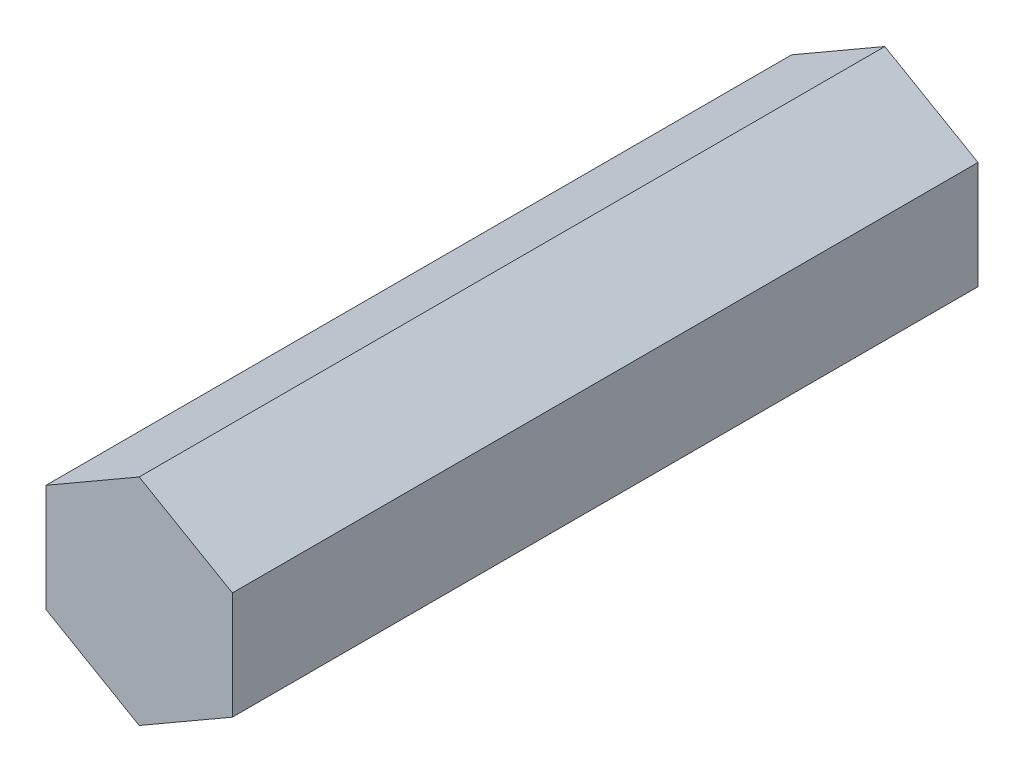
ISO-10303-21;
HEADER;
FILE_DESCRIPTION(('STEP AP214'),'2;1');
FILE_NAME('part.step','',(''),(''),'','','');
FILE_SCHEMA(('AUTOMOTIVE_DESIGN { 1 0 10303 214 1 1 1 1 }'));
ENDSEC;
DATA;
#1=APPLICATION_CONTEXT('core data for automotive mechanical design processes');
#2=APPLICATION_PROTOCOL_DEFINITION('international standard','automotive_design',2000,#1);
#3=PRODUCT_CONTEXT('',#1,'mechanical');
#4=PRODUCT('Part','Part','',(#3));
#5=PRODUCT_RELATED_PRODUCT_CATEGORY('part','',(#4));
#6=PRODUCT_DEFINITION_FORMATION('','',#4);
#7=PRODUCT_DEFINITION_CONTEXT('part definition',#1,'design');
#8=PRODUCT_DEFINITION('design','',#6,#7);
#9=PRODUCT_DEFINITION_SHAPE('','',#8);
#10=(LENGTH_UNIT() NAMED_UNIT(*) SI_UNIT(.MILLI.,.METRE.));
#11=(NAMED_UNIT(*) PLANE_ANGLE_UNIT() SI_UNIT($,.RADIAN.));
#12=(NAMED_UNIT(*) SI_UNIT($,.STERADIAN.) SOLID_ANGLE_UNIT());
#13=UNCERTAINTY_MEASURE_WITH_UNIT(LENGTH_MEASURE(1.E-05),#10,'distance_accuracy_value','');
#14=(GEOMETRIC_REPRESENTATION_CONTEXT(3) GLOBAL_UNCERTAINTY_ASSIGNED_CONTEXT((#13)) GLOBAL_UNIT_ASSIGNED_CONTEXT((#10,
#11,#12)) REPRESENTATION_CONTEXT('',''));
#15=CARTESIAN_POINT('',(0.,0.,0.));
#16=DIRECTION('',(0.,0.,1.));
#17=DIRECTION('',(1.,0.,0.));
#18=AXIS2_PLACEMENT_3D('',#15,#16,#17);
#19=CARTESIAN_POINT('',(-6.35,3.66617420935413,50.8));
#20=DIRECTION('',(1.,0.,0.));
#21=DIRECTION('',(0.,1.,0.));
#22=AXIS2_PLACEMENT_3D('',#19,#20,#21);
#23=PLANE('',#22);
#24=DIRECTION('',(0.,-1.,0.));
#25=VECTOR('',#24,1.);
#26=CARTESIAN_POINT('',(-6.35,3.66617420935413,0.));
#27=LINE('',#26,#25);
#28=CARTESIAN_POINT('',(-6.35,3.66617420935413,0.));
#29=VERTEX_POINT('',#28);
#30=CARTESIAN_POINT('',(-6.35,-3.66617420935412,0.));
#31=VERTEX_POINT('',#30);
#32=EDGE_CURVE('E117',#29,#31,#27,.T.);
#33=ORIENTED_EDGE('',*,*,#32,.T.);
#34=DIRECTION('',(0.,0.,-1.));
#35=VECTOR('',#34,1.);
#36=CARTESIAN_POINT('',(-6.35,-3.66617420935412,50.8));
#37=LINE('',#36,#35);
#38=CARTESIAN_POINT('',(-6.35,-3.66617420935412,50.8));
#39=VERTEX_POINT('',#38);
#40=EDGE_CURVE('E11',#39,#31,#37,.T.);
#41=ORIENTED_EDGE('',*,*,#40,.F.);
#42=DIRECTION('',(0.,-1.,0.));
#43=VECTOR('',#42,1.);
#44=CARTESIAN_POINT('',(-6.35,3.66617420935413,50.8));
#45=LINE('',#44,#43);
#46=CARTESIAN_POINT('',(-6.35,3.66617420935413,50.8));
#47=VERTEX_POINT('',#46);
#48=EDGE_CURVE('E127',#47,#39,#45,.T.);
#49=ORIENTED_EDGE('',*,*,#48,.F.);
#50=DIRECTION('',(0.,0.,-1.));
#51=VECTOR('',#50,1.);
#52=CARTESIAN_POINT('',(-6.35,3.66617420935413,50.8));
#53=LINE('',#52,#51);
#54=EDGE_CURVE('E113',#47,#29,#53,.T.);
#55=ORIENTED_EDGE('',*,*,#54,.T.);
#56=EDGE_LOOP('',(#33,#41,#49,#55));
#57=FACE_BOUND('',#56,.T.);
#58=ADVANCED_FACE('F33',(#57),#23,.F.);
#59=CARTESIAN_POINT('',(-6.35,-3.66617420935412,50.8));
#60=DIRECTION('',(0.5,0.866025403784439,0.));
#61=DIRECTION('',(-0.866025403784439,0.5,0.));
#62=AXIS2_PLACEMENT_3D('',#59,#60,#61);
#63=PLANE('',#62);
#64=DIRECTION('',(0.866025403784438,-0.5,0.));
#65=VECTOR('',#64,1.);
#66=CARTESIAN_POINT('',(-6.35,-3.66617420935412,0.));
#67=LINE('',#66,#65);
#68=CARTESIAN_POINT('',(0.,-7.33234841870825,0.));
#69=VERTEX_POINT('',#68);
#70=EDGE_CURVE('E120',#31,#69,#67,.T.);
#71=ORIENTED_EDGE('',*,*,#70,.T.);
#72=DIRECTION('',(0.,0.,-1.));
#73=VECTOR('',#72,1.);
#74=CARTESIAN_POINT('',(0.,-7.33234841870825,50.8));
#75=LINE('',#74,#73);
#76=CARTESIAN_POINT('',(0.,-7.33234841870825,50.8));
#77=VERTEX_POINT('',#76);
#78=EDGE_CURVE('E41',#77,#69,#75,.T.);
#79=ORIENTED_EDGE('',*,*,#78,.F.);
#80=DIRECTION('',(0.866025403784438,-0.5,0.));
#81=VECTOR('',#80,1.);
#82=CARTESIAN_POINT('',(-6.35,-3.66617420935412,50.8));
#83=LINE('',#82,#81);
#84=EDGE_CURVE('E86',#39,#77,#83,.T.);
#85=ORIENTED_EDGE('',*,*,#84,.F.);
#86=ORIENTED_EDGE('',*,*,#40,.T.);
#87=EDGE_LOOP('',(#71,#79,#85,#86));
#88=FACE_BOUND('',#87,.T.);
#89=ADVANCED_FACE('F151',(#88),#63,.F.);
#90=CARTESIAN_POINT('',(0.,-7.33234841870825,50.8));
#91=DIRECTION('',(-0.5,0.866025403784439,0.));
#92=DIRECTION('',(-0.866025403784439,-0.5,0.));
#93=AXIS2_PLACEMENT_3D('',#90,#91,#92);
#94=PLANE('',#93);
#95=DIRECTION('',(0.866025403784439,0.5,0.));
#96=VECTOR('',#95,1.);
#97=CARTESIAN_POINT('',(0.,-7.33234841870825,0.));
#98=LINE('',#97,#96);
#99=CARTESIAN_POINT('',(6.35,-3.66617420935412,0.));
#100=VERTEX_POINT('',#99);
#101=EDGE_CURVE('E122',#69,#100,#98,.T.);
#102=ORIENTED_EDGE('',*,*,#101,.T.);
#103=DIRECTION('',(0.,0.,-1.));
#104=VECTOR('',#103,1.);
#105=CARTESIAN_POINT('',(6.35,-3.66617420935412,50.8));
#106=LINE('',#105,#104);
#107=CARTESIAN_POINT('',(6.35,-3.66617420935412,50.8));
#108=VERTEX_POINT('',#107);
#109=EDGE_CURVE('E108',#108,#100,#106,.T.);
#110=ORIENTED_EDGE('',*,*,#109,.F.);
#111=DIRECTION('',(0.866025403784439,0.5,0.));
#112=VECTOR('',#111,1.);
#113=CARTESIAN_POINT('',(0.,-7.33234841870825,50.8));
#114=LINE('',#113,#112);
#115=EDGE_CURVE('E99',#77,#108,#114,.T.);
#116=ORIENTED_EDGE('',*,*,#115,.F.);
#117=ORIENTED_EDGE('',*,*,#78,.T.);
#118=EDGE_LOOP('',(#102,#110,#116,#117));
#119=FACE_BOUND('',#118,.T.);
#120=ADVANCED_FACE('F133',(#119),#94,.F.);
#121=CARTESIAN_POINT('',(6.35,-3.66617420935412,50.8));
#122=DIRECTION('',(-1.,0.,0.));
#123=DIRECTION('',(0.,0.,1.));
#124=AXIS2_PLACEMENT_3D('',#121,#122,#123);
#125=PLANE('',#124);
#126=DIRECTION('',(0.,1.,0.));
#127=VECTOR('',#126,1.);
#128=CARTESIAN_POINT('',(6.35,-3.66617420935412,0.));
#129=LINE('',#128,#127);
#130=CARTESIAN_POINT('',(6.35,3.66617420935413,0.));
#131=VERTEX_POINT('',#130);
#132=EDGE_CURVE('E107',#100,#131,#129,.T.);
#133=ORIENTED_EDGE('',*,*,#132,.T.);
#134=DIRECTION('',(0.,0.,-1.));
#135=VECTOR('',#134,1.);
#136=CARTESIAN_POINT('',(6.35,3.66617420935413,50.8));
#137=LINE('',#136,#135);
#138=CARTESIAN_POINT('',(6.35,3.66617420935413,50.8));
#139=VERTEX_POINT('',#138);
#140=EDGE_CURVE('E104',#139,#131,#137,.T.);
#141=ORIENTED_EDGE('',*,*,#140,.F.);
#142=DIRECTION('',(0.,1.,0.));
#143=VECTOR('',#142,1.);
#144=CARTESIAN_POINT('',(6.35,-3.66617420935412,50.8));
#145=LINE('',#144,#143);
#146=EDGE_CURVE('E93',#108,#139,#145,.T.);
#147=ORIENTED_EDGE('',*,*,#146,.F.);
#148=ORIENTED_EDGE('',*,*,#109,.T.);
#149=EDGE_LOOP('',(#133,#141,#147,#148));
#150=FACE_BOUND('',#149,.T.);
#151=ADVANCED_FACE('F105',(#150),#125,.F.);
#152=CARTESIAN_POINT('',(6.35,3.66617420935413,50.8));
#153=DIRECTION('',(-0.5,-0.866025403784439,0.));
#154=DIRECTION('',(0.866025403784439,-0.5,0.));
#155=AXIS2_PLACEMENT_3D('',#152,#153,#154);
#156=PLANE('',#155);
#157=DIRECTION('',(-0.866025403784439,0.5,0.));
#158=VECTOR('',#157,1.);
#159=CARTESIAN_POINT('',(6.35,3.66617420935413,0.));
#160=LINE('',#159,#158);
#161=CARTESIAN_POINT('',(0.,7.33234841870825,0.));
#162=VERTEX_POINT('',#161);
#163=EDGE_CURVE('E72',#131,#162,#160,.T.);
#164=ORIENTED_EDGE('',*,*,#163,.T.);
#165=DIRECTION('',(0.,0.,-1.));
#166=VECTOR('',#165,1.);
#167=CARTESIAN_POINT('',(0.,7.33234841870825,50.8));
#168=LINE('',#167,#166);
#169=CARTESIAN_POINT('',(0.,7.33234841870825,50.8));
#170=VERTEX_POINT('',#169);
#171=EDGE_CURVE('E109',#170,#162,#168,.T.);
#172=ORIENTED_EDGE('',*,*,#171,.F.);
#173=DIRECTION('',(-0.866025403784439,0.5,0.));
#174=VECTOR('',#173,1.);
#175=CARTESIAN_POINT('',(6.35,3.66617420935413,50.8));
#176=LINE('',#175,#174);
#177=EDGE_CURVE('E97',#139,#170,#176,.T.);
#178=ORIENTED_EDGE('',*,*,#177,.F.);
#179=ORIENTED_EDGE('',*,*,#140,.T.);
#180=EDGE_LOOP('',(#164,#172,#178,#179));
#181=FACE_BOUND('',#180,.T.);
#182=ADVANCED_FACE('F111',(#181),#156,.F.);
#183=CARTESIAN_POINT('',(0.,7.33234841870825,50.8));
#184=DIRECTION('',(0.5,-0.866025403784439,0.));
#185=DIRECTION('',(0.866025403784439,0.5,0.));
#186=AXIS2_PLACEMENT_3D('',#183,#184,#185);
#187=PLANE('',#186);
#188=DIRECTION('',(-0.866025403784439,-0.5,0.));
#189=VECTOR('',#188,1.);
#190=CARTESIAN_POINT('',(0.,7.33234841870825,0.));
#191=LINE('',#190,#189);
#192=EDGE_CURVE('E78',#162,#29,#191,.T.);
#193=ORIENTED_EDGE('',*,*,#192,.T.);
#194=ORIENTED_EDGE('',*,*,#54,.F.);
#195=DIRECTION('',(-0.866025403784439,-0.5,0.));
#196=VECTOR('',#195,1.);
#197=CARTESIAN_POINT('',(0.,7.33234841870825,50.8));
#198=LINE('',#197,#196);
#199=EDGE_CURVE('E49',#170,#47,#198,.T.);
#200=ORIENTED_EDGE('',*,*,#199,.F.);
#201=ORIENTED_EDGE('',*,*,#171,.T.);
#202=EDGE_LOOP('',(#193,#194,#200,#201));
#203=FACE_BOUND('',#202,.T.);
#204=ADVANCED_FACE('F140',(#203),#187,.F.);
#205=CARTESIAN_POINT('',(0.,0.,50.8));
#206=DIRECTION('',(0.,0.,1.));
#207=DIRECTION('',(1.,0.,0.));
#208=AXIS2_PLACEMENT_3D('',#205,#206,#207);
#209=PLANE('',#208);
#210=ORIENTED_EDGE('',*,*,#48,.T.);
#211=ORIENTED_EDGE('',*,*,#84,.T.);
#212=ORIENTED_EDGE('',*,*,#115,.T.);
#213=ORIENTED_EDGE('',*,*,#146,.T.);
#214=ORIENTED_EDGE('',*,*,#177,.T.);
#215=ORIENTED_EDGE('',*,*,#199,.T.);
#216=EDGE_LOOP('',(#210,#211,#212,#213,#214,#215));
#217=FACE_BOUND('',#216,.T.);
#218=ADVANCED_FACE('F95',(#217),#209,.T.);
#219=CARTESIAN_POINT('',(0.,0.,0.));
#220=DIRECTION('',(0.,0.,1.));
#221=DIRECTION('',(1.,0.,0.));
#222=AXIS2_PLACEMENT_3D('',#219,#220,#221);
#223=PLANE('',#222);
#224=ORIENTED_EDGE('',*,*,#32,.F.);
#225=ORIENTED_EDGE('',*,*,#192,.F.);
#226=ORIENTED_EDGE('',*,*,#163,.F.);
#227=ORIENTED_EDGE('',*,*,#132,.F.);
#228=ORIENTED_EDGE('',*,*,#101,.F.);
#229=ORIENTED_EDGE('',*,*,#70,.F.);
#230=EDGE_LOOP('',(#224,#225,#226,#227,#228,#229));
#231=FACE_BOUND('',#230,.T.);
#232=ADVANCED_FACE('F136',(#231),#223,.F.);
#233=CLOSED_SHELL('',(#58,#89,#120,#151,#182,#204,#218,#232));
#234=MANIFOLD_SOLID_BREP('B2',#233);
#235=ADVANCED_BREP_SHAPE_REPRESENTATION('',(#18,#234),#14);
#236=SHAPE_DEFINITION_REPRESENTATION(#9,#235);
ENDSEC;
END-ISO-10303-21;
